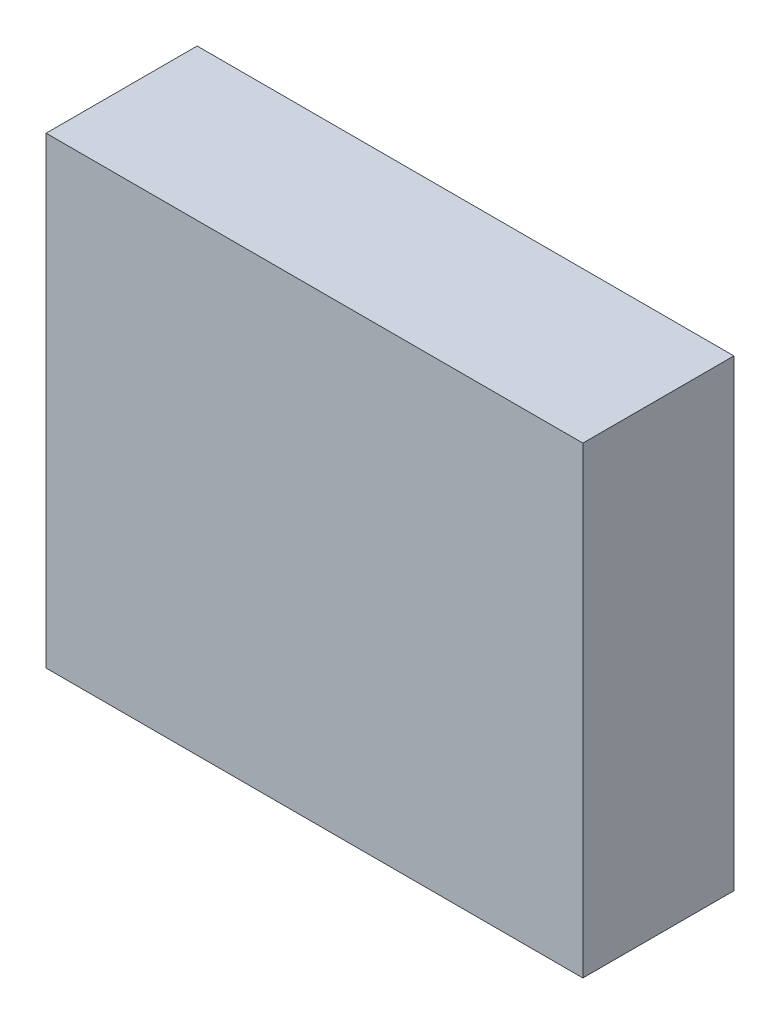
ISO-10303-21;
HEADER;
FILE_DESCRIPTION(('STEP AP214'),'2;1');
FILE_NAME('part.step','',(''),(''),'','','');
FILE_SCHEMA(('AUTOMOTIVE_DESIGN { 1 0 10303 214 1 1 1 1 }'));
ENDSEC;
DATA;
#1=APPLICATION_CONTEXT('core data for automotive mechanical design processes');
#2=APPLICATION_PROTOCOL_DEFINITION('international standard','automotive_design',2000,#1);
#3=PRODUCT_CONTEXT('',#1,'mechanical');
#4=PRODUCT('Part','Part','',(#3));
#5=PRODUCT_RELATED_PRODUCT_CATEGORY('part','',(#4));
#6=PRODUCT_DEFINITION_FORMATION('','',#4);
#7=PRODUCT_DEFINITION_CONTEXT('part definition',#1,'design');
#8=PRODUCT_DEFINITION('design','',#6,#7);
#9=PRODUCT_DEFINITION_SHAPE('','',#8);
#10=(LENGTH_UNIT() NAMED_UNIT(*) SI_UNIT(.MILLI.,.METRE.));
#11=(NAMED_UNIT(*) PLANE_ANGLE_UNIT() SI_UNIT($,.RADIAN.));
#12=(NAMED_UNIT(*) SI_UNIT($,.STERADIAN.) SOLID_ANGLE_UNIT());
#13=UNCERTAINTY_MEASURE_WITH_UNIT(LENGTH_MEASURE(1.E-05),#10,'distance_accuracy_value','');
#14=(GEOMETRIC_REPRESENTATION_CONTEXT(3) GLOBAL_UNCERTAINTY_ASSIGNED_CONTEXT((#13)) GLOBAL_UNIT_ASSIGNED_CONTEXT((#10,
#11,#12)) REPRESENTATION_CONTEXT('',''));
#15=CARTESIAN_POINT('',(0.,0.,0.));
#16=DIRECTION('',(0.,0.,1.));
#17=DIRECTION('',(1.,0.,0.));
#18=AXIS2_PLACEMENT_3D('',#15,#16,#17);
#19=CARTESIAN_POINT('',(-1.82500016,1.57500066,1.02700074));
#20=DIRECTION('',(0.,0.,1.));
#21=DIRECTION('',(1.,0.,0.));
#22=AXIS2_PLACEMENT_3D('',#19,#20,#21);
#23=PLANE('',#22);
#24=DIRECTION('',(0.,1.,0.));
#25=VECTOR('',#24,1.);
#26=CARTESIAN_POINT('',(1.82500016,1.57500066,1.02700074));
#27=LINE('',#26,#25);
#28=CARTESIAN_POINT('',(1.82500016,1.57500066,1.02700074));
#29=VERTEX_POINT('',#28);
#30=CARTESIAN_POINT('',(1.82500016,-1.57500066,1.02700074));
#31=VERTEX_POINT('',#30);
#32=EDGE_CURVE('E53',#29,#31,#27,.F.);
#33=ORIENTED_EDGE('',*,*,#32,.F.);
#34=DIRECTION('',(1.,0.,0.));
#35=VECTOR('',#34,1.);
#36=CARTESIAN_POINT('',(-1.82500016,1.57500066,1.02700074));
#37=LINE('',#36,#35);
#38=CARTESIAN_POINT('',(-1.82500016,1.57500066,1.02700074));
#39=VERTEX_POINT('',#38);
#40=EDGE_CURVE('E68',#39,#29,#37,.T.);
#41=ORIENTED_EDGE('',*,*,#40,.F.);
#42=DIRECTION('',(0.,1.,0.));
#43=VECTOR('',#42,1.);
#44=CARTESIAN_POINT('',(-1.82500016,-1.57500066,1.02700074));
#45=LINE('',#44,#43);
#46=CARTESIAN_POINT('',(-1.82500016,-1.57500066,1.02700074));
#47=VERTEX_POINT('',#46);
#48=EDGE_CURVE('E20',#47,#39,#45,.T.);
#49=ORIENTED_EDGE('',*,*,#48,.F.);
#50=DIRECTION('',(1.,0.,0.));
#51=VECTOR('',#50,1.);
#52=CARTESIAN_POINT('',(1.82500016,-1.57500066,1.02700074));
#53=LINE('',#52,#51);
#54=EDGE_CURVE('E58',#31,#47,#53,.F.);
#55=ORIENTED_EDGE('',*,*,#54,.F.);
#56=EDGE_LOOP('',(#33,#41,#49,#55));
#57=FACE_BOUND('',#56,.T.);
#58=ADVANCED_FACE('F17',(#57),#23,.T.);
#59=CARTESIAN_POINT('',(-1.82500016,-1.57500066,0.));
#60=DIRECTION('',(-1.,0.,0.));
#61=DIRECTION('',(0.,0.,1.));
#62=AXIS2_PLACEMENT_3D('',#59,#60,#61);
#63=PLANE('',#62);
#64=DIRECTION('',(0.,0.,1.));
#65=VECTOR('',#64,1.);
#66=CARTESIAN_POINT('',(-1.82500016,1.57500066,0.));
#67=LINE('',#66,#65);
#68=CARTESIAN_POINT('',(-1.82500016,1.57500066,0.));
#69=VERTEX_POINT('',#68);
#70=EDGE_CURVE('E79',#69,#39,#67,.T.);
#71=ORIENTED_EDGE('',*,*,#70,.F.);
#72=DIRECTION('',(0.,1.,0.));
#73=VECTOR('',#72,1.);
#74=CARTESIAN_POINT('',(-1.82500016,1.57500066,0.));
#75=LINE('',#74,#73);
#76=CARTESIAN_POINT('',(-1.82500016,-1.57500066,0.));
#77=VERTEX_POINT('',#76);
#78=EDGE_CURVE('E74',#69,#77,#75,.F.);
#79=ORIENTED_EDGE('',*,*,#78,.T.);
#80=DIRECTION('',(0.,0.,-1.));
#81=VECTOR('',#80,1.);
#82=CARTESIAN_POINT('',(-1.82500016,-1.57500066,0.));
#83=LINE('',#82,#81);
#84=EDGE_CURVE('E63',#47,#77,#83,.T.);
#85=ORIENTED_EDGE('',*,*,#84,.F.);
#86=ORIENTED_EDGE('',*,*,#48,.T.);
#87=EDGE_LOOP('',(#71,#79,#85,#86));
#88=FACE_BOUND('',#87,.T.);
#89=ADVANCED_FACE('F73',(#88),#63,.T.);
#90=CARTESIAN_POINT('',(1.82500016,-1.57500066,0.));
#91=DIRECTION('',(0.,-1.,0.));
#92=DIRECTION('',(0.,0.,-1.));
#93=AXIS2_PLACEMENT_3D('',#90,#91,#92);
#94=PLANE('',#93);
#95=ORIENTED_EDGE('',*,*,#84,.T.);
#96=DIRECTION('',(1.,0.,0.));
#97=VECTOR('',#96,1.);
#98=CARTESIAN_POINT('',(-1.82500016,-1.57500066,0.));
#99=LINE('',#98,#97);
#100=CARTESIAN_POINT('',(1.82500016,-1.57500066,0.));
#101=VERTEX_POINT('',#100);
#102=EDGE_CURVE('E84',#77,#101,#99,.T.);
#103=ORIENTED_EDGE('',*,*,#102,.T.);
#104=DIRECTION('',(0.,0.,-1.));
#105=VECTOR('',#104,1.);
#106=CARTESIAN_POINT('',(1.82500016,-1.57500066,0.));
#107=LINE('',#106,#105);
#108=EDGE_CURVE('E65',#31,#101,#107,.T.);
#109=ORIENTED_EDGE('',*,*,#108,.F.);
#110=ORIENTED_EDGE('',*,*,#54,.T.);
#111=EDGE_LOOP('',(#95,#103,#109,#110));
#112=FACE_BOUND('',#111,.T.);
#113=ADVANCED_FACE('F60',(#112),#94,.T.);
#114=CARTESIAN_POINT('',(1.82500016,1.57500066,0.));
#115=DIRECTION('',(1.,0.,0.));
#116=DIRECTION('',(0.,0.,-1.));
#117=AXIS2_PLACEMENT_3D('',#114,#115,#116);
#118=PLANE('',#117);
#119=ORIENTED_EDGE('',*,*,#108,.T.);
#120=DIRECTION('',(0.,1.,0.));
#121=VECTOR('',#120,1.);
#122=CARTESIAN_POINT('',(1.82500016,1.57500066,0.));
#123=LINE('',#122,#121);
#124=CARTESIAN_POINT('',(1.82500016,1.57500066,0.));
#125=VERTEX_POINT('',#124);
#126=EDGE_CURVE('E26',#101,#125,#123,.T.);
#127=ORIENTED_EDGE('',*,*,#126,.T.);
#128=DIRECTION('',(0.,0.,1.));
#129=VECTOR('',#128,1.);
#130=CARTESIAN_POINT('',(1.82500016,1.57500066,0.));
#131=LINE('',#130,#129);
#132=EDGE_CURVE('E34',#29,#125,#131,.F.);
#133=ORIENTED_EDGE('',*,*,#132,.F.);
#134=ORIENTED_EDGE('',*,*,#32,.T.);
#135=EDGE_LOOP('',(#119,#127,#133,#134));
#136=FACE_BOUND('',#135,.T.);
#137=ADVANCED_FACE('F88',(#136),#118,.T.);
#138=CARTESIAN_POINT('',(-1.82500016,1.57500066,0.));
#139=DIRECTION('',(0.,1.,0.));
#140=DIRECTION('',(0.,0.,1.));
#141=AXIS2_PLACEMENT_3D('',#138,#139,#140);
#142=PLANE('',#141);
#143=ORIENTED_EDGE('',*,*,#132,.T.);
#144=DIRECTION('',(1.,0.,0.));
#145=VECTOR('',#144,1.);
#146=CARTESIAN_POINT('',(-1.82500016,1.57500066,0.));
#147=LINE('',#146,#145);
#148=EDGE_CURVE('E11',#125,#69,#147,.F.);
#149=ORIENTED_EDGE('',*,*,#148,.T.);
#150=ORIENTED_EDGE('',*,*,#70,.T.);
#151=ORIENTED_EDGE('',*,*,#40,.T.);
#152=EDGE_LOOP('',(#143,#149,#150,#151));
#153=FACE_BOUND('',#152,.T.);
#154=ADVANCED_FACE('F91',(#153),#142,.T.);
#155=CARTESIAN_POINT('',(-1.82500016,1.57500066,0.));
#156=DIRECTION('',(0.,0.,1.));
#157=DIRECTION('',(1.,0.,0.));
#158=AXIS2_PLACEMENT_3D('',#155,#156,#157);
#159=PLANE('',#158);
#160=ORIENTED_EDGE('',*,*,#126,.F.);
#161=ORIENTED_EDGE('',*,*,#102,.F.);
#162=ORIENTED_EDGE('',*,*,#78,.F.);
#163=ORIENTED_EDGE('',*,*,#148,.F.);
#164=EDGE_LOOP('',(#160,#161,#162,#163));
#165=FACE_BOUND('',#164,.T.);
#166=ADVANCED_FACE('F90',(#165),#159,.F.);
#167=CLOSED_SHELL('',(#58,#89,#113,#137,#154,#166));
#168=MANIFOLD_SOLID_BREP('B1',#167);
#169=ADVANCED_BREP_SHAPE_REPRESENTATION('',(#18,#168),#14);
#170=SHAPE_DEFINITION_REPRESENTATION(#9,#169);
ENDSEC;
END-ISO-10303-21;
